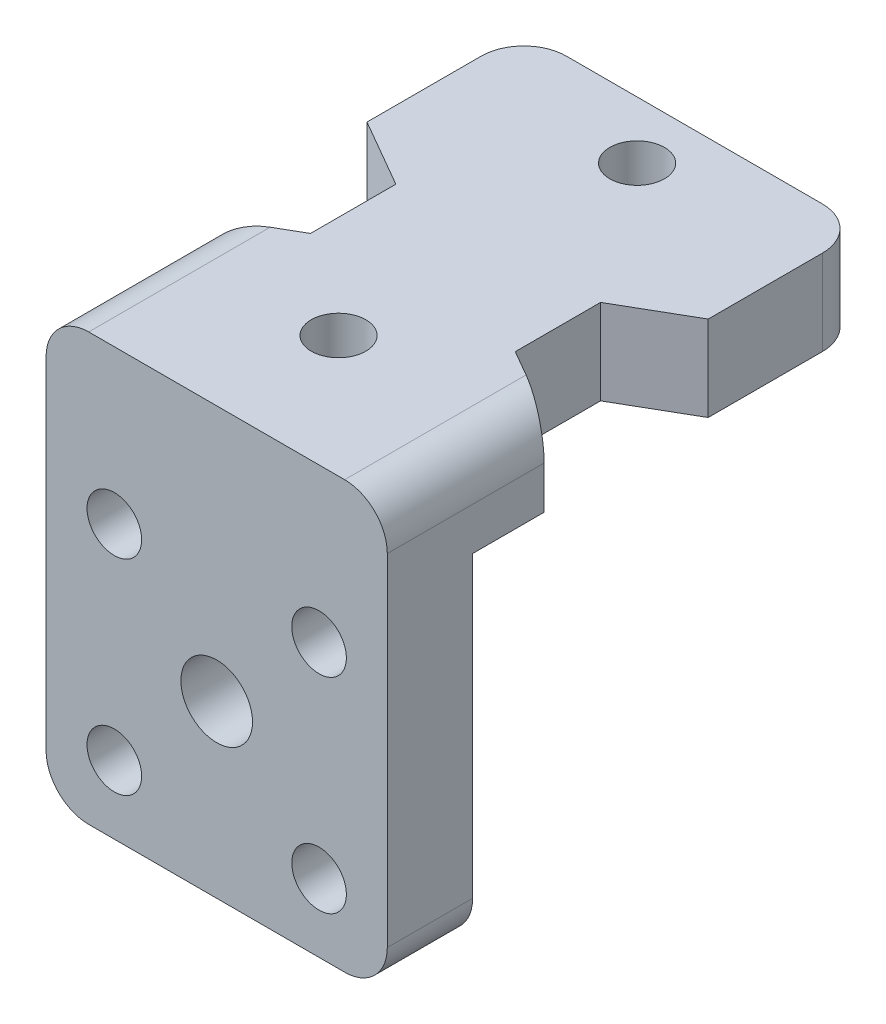
ISO-10303-21;
HEADER;
FILE_DESCRIPTION(('STEP AP214'),'2;1');
FILE_NAME('part.step','',(''),(''),'','','');
FILE_SCHEMA(('AUTOMOTIVE_DESIGN { 1 0 10303 214 1 1 1 1 }'));
ENDSEC;
DATA;
#1=APPLICATION_CONTEXT('core data for automotive mechanical design processes');
#2=APPLICATION_PROTOCOL_DEFINITION('international standard','automotive_design',2000,#1);
#3=PRODUCT_CONTEXT('',#1,'mechanical');
#4=PRODUCT('Part','Part','',(#3));
#5=PRODUCT_RELATED_PRODUCT_CATEGORY('part','',(#4));
#6=PRODUCT_DEFINITION_FORMATION('','',#4);
#7=PRODUCT_DEFINITION_CONTEXT('part definition',#1,'design');
#8=PRODUCT_DEFINITION('design','',#6,#7);
#9=PRODUCT_DEFINITION_SHAPE('','',#8);
#10=(LENGTH_UNIT() NAMED_UNIT(*) SI_UNIT(.MILLI.,.METRE.));
#11=(NAMED_UNIT(*) PLANE_ANGLE_UNIT() SI_UNIT($,.RADIAN.));
#12=(NAMED_UNIT(*) SI_UNIT($,.STERADIAN.) SOLID_ANGLE_UNIT());
#13=UNCERTAINTY_MEASURE_WITH_UNIT(LENGTH_MEASURE(1.E-05),#10,'distance_accuracy_value','');
#14=(GEOMETRIC_REPRESENTATION_CONTEXT(3) GLOBAL_UNCERTAINTY_ASSIGNED_CONTEXT((#13)) GLOBAL_UNIT_ASSIGNED_CONTEXT((#10,
#11,#12)) REPRESENTATION_CONTEXT('',''));
#15=CARTESIAN_POINT('',(0.,0.,0.));
#16=DIRECTION('',(0.,0.,1.));
#17=DIRECTION('',(1.,0.,0.));
#18=AXIS2_PLACEMENT_3D('',#15,#16,#17);
#19=CARTESIAN_POINT('',(10.,-10.,5.));
#20=DIRECTION('',(-1.,0.,0.));
#21=DIRECTION('',(0.,0.,1.));
#22=AXIS2_PLACEMENT_3D('',#19,#20,#21);
#23=PLANE('',#22);
#24=DIRECTION('',(0.,-1.,0.));
#25=VECTOR('',#24,1.);
#26=CARTESIAN_POINT('',(10.,15.,-4.19059892324151));
#27=LINE('',#26,#25);
#28=CARTESIAN_POINT('',(10.,12.5,-4.19059892324151));
#29=VERTEX_POINT('',#28);
#30=CARTESIAN_POINT('',(10.,10.,-4.19059892324151));
#31=VERTEX_POINT('',#30);
#32=EDGE_CURVE('E207',#29,#31,#27,.T.);
#33=ORIENTED_EDGE('',*,*,#32,.F.);
#34=DIRECTION('',(0.,0.,-1.));
#35=VECTOR('',#34,1.);
#36=CARTESIAN_POINT('',(10.,12.5,5.));
#37=LINE('',#36,#35);
#38=CARTESIAN_POINT('',(10.,12.5,5.));
#39=VERTEX_POINT('',#38);
#40=EDGE_CURVE('E388',#29,#39,#37,.F.);
#41=ORIENTED_EDGE('',*,*,#40,.T.);
#42=DIRECTION('',(0.,1.,0.));
#43=VECTOR('',#42,1.);
#44=CARTESIAN_POINT('',(10.,-10.,5.));
#45=LINE('',#44,#43);
#46=CARTESIAN_POINT('',(10.,-7.5,5.));
#47=VERTEX_POINT('',#46);
#48=EDGE_CURVE('E309',#47,#39,#45,.T.);
#49=ORIENTED_EDGE('',*,*,#48,.F.);
#50=DIRECTION('',(0.,0.,-1.));
#51=VECTOR('',#50,1.);
#52=CARTESIAN_POINT('',(10.,-7.5,5.));
#53=LINE('',#52,#51);
#54=CARTESIAN_POINT('',(10.,-7.5,0.));
#55=VERTEX_POINT('',#54);
#56=EDGE_CURVE('E321',#47,#55,#53,.T.);
#57=ORIENTED_EDGE('',*,*,#56,.T.);
#58=DIRECTION('',(0.,1.,0.));
#59=VECTOR('',#58,1.);
#60=CARTESIAN_POINT('',(10.,-10.,0.));
#61=LINE('',#60,#59);
#62=CARTESIAN_POINT('',(10.,10.,0.));
#63=VERTEX_POINT('',#62);
#64=EDGE_CURVE('E305',#55,#63,#61,.T.);
#65=ORIENTED_EDGE('',*,*,#64,.T.);
#66=DIRECTION('',(0.,0.,-1.));
#67=VECTOR('',#66,1.);
#68=CARTESIAN_POINT('',(10.,10.,5.));
#69=LINE('',#68,#67);
#70=EDGE_CURVE('E245',#63,#31,#69,.T.);
#71=ORIENTED_EDGE('',*,*,#70,.T.);
#72=EDGE_LOOP('',(#33,#41,#49,#57,#65,#71));
#73=FACE_BOUND('',#72,.T.);
#74=ADVANCED_FACE('F45',(#73),#23,.F.);
#75=CARTESIAN_POINT('',(-10.,-10.,5.));
#76=DIRECTION('',(1.,0.,0.));
#77=DIRECTION('',(0.,0.,-1.));
#78=AXIS2_PLACEMENT_3D('',#75,#76,#77);
#79=PLANE('',#78);
#80=DIRECTION('',(0.,-1.,0.));
#81=VECTOR('',#80,1.);
#82=CARTESIAN_POINT('',(-10.,-10.,5.));
#83=LINE('',#82,#81);
#84=CARTESIAN_POINT('',(-10.,12.5,5.));
#85=VERTEX_POINT('',#84);
#86=CARTESIAN_POINT('',(-10.,-7.5,5.));
#87=VERTEX_POINT('',#86);
#88=EDGE_CURVE('E313',#85,#87,#83,.T.);
#89=ORIENTED_EDGE('',*,*,#88,.F.);
#90=DIRECTION('',(0.,0.,1.));
#91=VECTOR('',#90,1.);
#92=CARTESIAN_POINT('',(-10.,12.5,5.));
#93=LINE('',#92,#91);
#94=CARTESIAN_POINT('',(-10.,12.5,-4.19059892324151));
#95=VERTEX_POINT('',#94);
#96=EDGE_CURVE('E379',#85,#95,#93,.F.);
#97=ORIENTED_EDGE('',*,*,#96,.T.);
#98=DIRECTION('',(0.,-1.,0.));
#99=VECTOR('',#98,1.);
#100=CARTESIAN_POINT('',(-10.,15.,-4.19059892324151));
#101=LINE('',#100,#99);
#102=CARTESIAN_POINT('',(-10.,10.,-4.19059892324151));
#103=VERTEX_POINT('',#102);
#104=EDGE_CURVE('E240',#95,#103,#101,.T.);
#105=ORIENTED_EDGE('',*,*,#104,.T.);
#106=DIRECTION('',(0.,0.,1.));
#107=VECTOR('',#106,1.);
#108=CARTESIAN_POINT('',(-10.,10.,5.));
#109=LINE('',#108,#107);
#110=CARTESIAN_POINT('',(-10.,10.,0.));
#111=VERTEX_POINT('',#110);
#112=EDGE_CURVE('E241',#103,#111,#109,.T.);
#113=ORIENTED_EDGE('',*,*,#112,.T.);
#114=DIRECTION('',(0.,-1.,0.));
#115=VECTOR('',#114,1.);
#116=CARTESIAN_POINT('',(-10.,-10.,0.));
#117=LINE('',#116,#115);
#118=CARTESIAN_POINT('',(-10.,-7.5,0.));
#119=VERTEX_POINT('',#118);
#120=EDGE_CURVE('E328',#111,#119,#117,.T.);
#121=ORIENTED_EDGE('',*,*,#120,.T.);
#122=DIRECTION('',(0.,0.,-1.));
#123=VECTOR('',#122,1.);
#124=CARTESIAN_POINT('',(-10.,-7.5,5.));
#125=LINE('',#124,#123);
#126=EDGE_CURVE('E357',#119,#87,#125,.F.);
#127=ORIENTED_EDGE('',*,*,#126,.T.);
#128=EDGE_LOOP('',(#89,#97,#105,#113,#121,#127));
#129=FACE_BOUND('',#128,.T.);
#130=ADVANCED_FACE('F442',(#129),#79,.F.);
#131=CARTESIAN_POINT('',(-10.,-10.,5.));
#132=DIRECTION('',(0.,1.,0.));
#133=DIRECTION('',(0.,0.,1.));
#134=AXIS2_PLACEMENT_3D('',#131,#132,#133);
#135=PLANE('',#134);
#136=DIRECTION('',(1.,0.,0.));
#137=VECTOR('',#136,1.);
#138=CARTESIAN_POINT('',(-10.,-10.,0.));
#139=LINE('',#138,#137);
#140=CARTESIAN_POINT('',(-7.5,-10.,0.));
#141=VERTEX_POINT('',#140);
#142=CARTESIAN_POINT('',(7.5,-10.,0.));
#143=VERTEX_POINT('',#142);
#144=EDGE_CURVE('E314',#141,#143,#139,.T.);
#145=ORIENTED_EDGE('',*,*,#144,.T.);
#146=DIRECTION('',(0.,0.,-1.));
#147=VECTOR('',#146,1.);
#148=CARTESIAN_POINT('',(7.5,-10.,5.));
#149=LINE('',#148,#147);
#150=CARTESIAN_POINT('',(7.5,-10.,5.));
#151=VERTEX_POINT('',#150);
#152=EDGE_CURVE('E348',#143,#151,#149,.F.);
#153=ORIENTED_EDGE('',*,*,#152,.T.);
#154=DIRECTION('',(1.,0.,0.));
#155=VECTOR('',#154,1.);
#156=CARTESIAN_POINT('',(-10.,-10.,5.));
#157=LINE('',#156,#155);
#158=CARTESIAN_POINT('',(-7.5,-10.,5.));
#159=VERTEX_POINT('',#158);
#160=EDGE_CURVE('E317',#159,#151,#157,.T.);
#161=ORIENTED_EDGE('',*,*,#160,.F.);
#162=DIRECTION('',(0.,0.,-1.));
#163=VECTOR('',#162,1.);
#164=CARTESIAN_POINT('',(-7.5,-10.,5.));
#165=LINE('',#164,#163);
#166=EDGE_CURVE('E344',#159,#141,#165,.T.);
#167=ORIENTED_EDGE('',*,*,#166,.T.);
#168=EDGE_LOOP('',(#145,#153,#161,#167));
#169=FACE_BOUND('',#168,.T.);
#170=ADVANCED_FACE('F449',(#169),#135,.F.);
#171=CARTESIAN_POINT('',(0.,0.,5.));
#172=DIRECTION('',(0.,0.,-1.));
#173=DIRECTION('',(-1.,0.,0.));
#174=AXIS2_PLACEMENT_3D('',#171,#172,#173);
#175=PLANE('',#174);
#176=CARTESIAN_POINT('',(6.,-6.,5.));
#177=DIRECTION('',(0.,0.,-1.));
#178=DIRECTION('',(-1.,0.,0.));
#179=AXIS2_PLACEMENT_3D('',#176,#177,#178);
#180=CIRCLE('',#179,1.6);
#181=CARTESIAN_POINT('',(4.4,-6.,5.));
#182=VERTEX_POINT('',#181);
#183=EDGE_CURVE('E494',#182,#182,#180,.T.);
#184=ORIENTED_EDGE('',*,*,#183,.T.);
#185=EDGE_LOOP('',(#184));
#186=FACE_BOUND('',#185,.T.);
#187=CARTESIAN_POINT('',(-6.,-6.,5.));
#188=DIRECTION('',(0.,0.,-1.));
#189=DIRECTION('',(-1.,0.,0.));
#190=AXIS2_PLACEMENT_3D('',#187,#188,#189);
#191=CIRCLE('',#190,1.6);
#192=CARTESIAN_POINT('',(-7.6,-6.,5.));
#193=VERTEX_POINT('',#192);
#194=EDGE_CURVE('E501',#193,#193,#191,.T.);
#195=ORIENTED_EDGE('',*,*,#194,.T.);
#196=EDGE_LOOP('',(#195));
#197=FACE_BOUND('',#196,.T.);
#198=CARTESIAN_POINT('',(-6.,6.,5.));
#199=DIRECTION('',(0.,0.,-1.));
#200=DIRECTION('',(-1.,0.,0.));
#201=AXIS2_PLACEMENT_3D('',#198,#199,#200);
#202=CIRCLE('',#201,1.6);
#203=CARTESIAN_POINT('',(-7.6,6.,5.));
#204=VERTEX_POINT('',#203);
#205=EDGE_CURVE('E505',#204,#204,#202,.T.);
#206=ORIENTED_EDGE('',*,*,#205,.T.);
#207=EDGE_LOOP('',(#206));
#208=FACE_BOUND('',#207,.T.);
#209=CARTESIAN_POINT('',(6.,6.,5.));
#210=DIRECTION('',(0.,0.,-1.));
#211=DIRECTION('',(-1.,0.,0.));
#212=AXIS2_PLACEMENT_3D('',#209,#210,#211);
#213=CIRCLE('',#212,1.6);
#214=CARTESIAN_POINT('',(4.4,6.,5.));
#215=VERTEX_POINT('',#214);
#216=EDGE_CURVE('E509',#215,#215,#213,.T.);
#217=ORIENTED_EDGE('',*,*,#216,.T.);
#218=EDGE_LOOP('',(#217));
#219=FACE_BOUND('',#218,.T.);
#220=CARTESIAN_POINT('',(0.,0.,5.));
#221=DIRECTION('',(0.,0.,1.));
#222=DIRECTION('',(1.,0.,0.));
#223=AXIS2_PLACEMENT_3D('',#220,#221,#222);
#224=CIRCLE('',#223,2.1);
#225=CARTESIAN_POINT('',(2.1,0.,5.));
#226=VERTEX_POINT('',#225);
#227=EDGE_CURVE('E300',#226,#226,#224,.T.);
#228=ORIENTED_EDGE('',*,*,#227,.F.);
#229=EDGE_LOOP('',(#228));
#230=FACE_BOUND('',#229,.T.);
#231=DIRECTION('',(1.,0.,0.));
#232=VECTOR('',#231,1.);
#233=CARTESIAN_POINT('',(-10.,15.,5.));
#234=LINE('',#233,#232);
#235=CARTESIAN_POINT('',(-7.5,15.,5.));
#236=VERTEX_POINT('',#235);
#237=CARTESIAN_POINT('',(7.5,15.,5.));
#238=VERTEX_POINT('',#237);
#239=EDGE_CURVE('E197',#236,#238,#234,.T.);
#240=ORIENTED_EDGE('',*,*,#239,.F.);
#241=CARTESIAN_POINT('',(-7.5,12.5,5.));
#242=DIRECTION('',(0.,0.,-1.));
#243=DIRECTION('',(-1.,0.,0.));
#244=AXIS2_PLACEMENT_3D('',#241,#242,#243);
#245=CIRCLE('',#244,2.5);
#246=EDGE_CURVE('E376',#236,#85,#245,.F.);
#247=ORIENTED_EDGE('',*,*,#246,.T.);
#248=ORIENTED_EDGE('',*,*,#88,.T.);
#249=CARTESIAN_POINT('',(-7.5,-7.5,5.));
#250=DIRECTION('',(0.,0.,-1.));
#251=DIRECTION('',(-1.,0.,0.));
#252=AXIS2_PLACEMENT_3D('',#249,#250,#251);
#253=CIRCLE('',#252,2.5);
#254=EDGE_CURVE('E351',#87,#159,#253,.F.);
#255=ORIENTED_EDGE('',*,*,#254,.T.);
#256=ORIENTED_EDGE('',*,*,#160,.T.);
#257=CARTESIAN_POINT('',(7.5,-7.5,5.));
#258=DIRECTION('',(0.,0.,-1.));
#259=DIRECTION('',(-1.,0.,0.));
#260=AXIS2_PLACEMENT_3D('',#257,#258,#259);
#261=CIRCLE('',#260,2.5);
#262=EDGE_CURVE('E354',#151,#47,#261,.F.);
#263=ORIENTED_EDGE('',*,*,#262,.T.);
#264=ORIENTED_EDGE('',*,*,#48,.T.);
#265=CARTESIAN_POINT('',(7.5,12.5,5.));
#266=DIRECTION('',(0.,0.,-1.));
#267=DIRECTION('',(-1.,0.,0.));
#268=AXIS2_PLACEMENT_3D('',#265,#266,#267);
#269=CIRCLE('',#268,2.5);
#270=EDGE_CURVE('E373',#39,#238,#269,.F.);
#271=ORIENTED_EDGE('',*,*,#270,.T.);
#272=EDGE_LOOP('',(#240,#247,#248,#255,#256,#263,#264,#271));
#273=FACE_BOUND('',#272,.T.);
#274=ADVANCED_FACE('F477',(#186,#197,#208,#219,#230,#273),#175,.F.);
#275=CARTESIAN_POINT('',(0.,0.,0.));
#276=DIRECTION('',(0.,0.,-1.));
#277=DIRECTION('',(-1.,0.,0.));
#278=AXIS2_PLACEMENT_3D('',#275,#276,#277);
#279=PLANE('',#278);
#280=CARTESIAN_POINT('',(6.,-6.,0.));
#281=DIRECTION('',(0.,0.,-1.));
#282=DIRECTION('',(-1.,0.,0.));
#283=AXIS2_PLACEMENT_3D('',#280,#281,#282);
#284=CIRCLE('',#283,1.6);
#285=CARTESIAN_POINT('',(4.4,-6.,0.));
#286=VERTEX_POINT('',#285);
#287=EDGE_CURVE('E518',#286,#286,#284,.T.);
#288=ORIENTED_EDGE('',*,*,#287,.F.);
#289=EDGE_LOOP('',(#288));
#290=FACE_BOUND('',#289,.T.);
#291=CARTESIAN_POINT('',(-6.,-6.,0.));
#292=DIRECTION('',(0.,0.,-1.));
#293=DIRECTION('',(-1.,0.,0.));
#294=AXIS2_PLACEMENT_3D('',#291,#292,#293);
#295=CIRCLE('',#294,1.6);
#296=CARTESIAN_POINT('',(-7.6,-6.,0.));
#297=VERTEX_POINT('',#296);
#298=EDGE_CURVE('E522',#297,#297,#295,.T.);
#299=ORIENTED_EDGE('',*,*,#298,.F.);
#300=EDGE_LOOP('',(#299));
#301=FACE_BOUND('',#300,.T.);
#302=CARTESIAN_POINT('',(-6.,6.,0.));
#303=DIRECTION('',(0.,0.,-1.));
#304=DIRECTION('',(-1.,0.,0.));
#305=AXIS2_PLACEMENT_3D('',#302,#303,#304);
#306=CIRCLE('',#305,1.6);
#307=CARTESIAN_POINT('',(-7.6,6.,0.));
#308=VERTEX_POINT('',#307);
#309=EDGE_CURVE('E517',#308,#308,#306,.T.);
#310=ORIENTED_EDGE('',*,*,#309,.F.);
#311=EDGE_LOOP('',(#310));
#312=FACE_BOUND('',#311,.T.);
#313=CARTESIAN_POINT('',(6.,6.,0.));
#314=DIRECTION('',(0.,0.,-1.));
#315=DIRECTION('',(-1.,0.,0.));
#316=AXIS2_PLACEMENT_3D('',#313,#314,#315);
#317=CIRCLE('',#316,1.6);
#318=CARTESIAN_POINT('',(4.4,6.,0.));
#319=VERTEX_POINT('',#318);
#320=EDGE_CURVE('E513',#319,#319,#317,.T.);
#321=ORIENTED_EDGE('',*,*,#320,.F.);
#322=EDGE_LOOP('',(#321));
#323=FACE_BOUND('',#322,.T.);
#324=CARTESIAN_POINT('',(0.,0.,0.));
#325=DIRECTION('',(0.,0.,1.));
#326=DIRECTION('',(1.,0.,0.));
#327=AXIS2_PLACEMENT_3D('',#324,#325,#326);
#328=CIRCLE('',#327,2.1);
#329=CARTESIAN_POINT('',(2.1,0.,0.));
#330=VERTEX_POINT('',#329);
#331=EDGE_CURVE('E301',#330,#330,#328,.T.);
#332=ORIENTED_EDGE('',*,*,#331,.T.);
#333=EDGE_LOOP('',(#332));
#334=FACE_BOUND('',#333,.T.);
#335=ORIENTED_EDGE('',*,*,#64,.F.);
#336=CARTESIAN_POINT('',(7.5,-7.5,0.));
#337=DIRECTION('',(0.,0.,-1.));
#338=DIRECTION('',(-1.,0.,0.));
#339=AXIS2_PLACEMENT_3D('',#336,#337,#338);
#340=CIRCLE('',#339,2.5);
#341=EDGE_CURVE('E341',#55,#143,#340,.T.);
#342=ORIENTED_EDGE('',*,*,#341,.T.);
#343=ORIENTED_EDGE('',*,*,#144,.F.);
#344=CARTESIAN_POINT('',(-7.5,-7.5,0.));
#345=DIRECTION('',(0.,0.,-1.));
#346=DIRECTION('',(-1.,0.,0.));
#347=AXIS2_PLACEMENT_3D('',#344,#345,#346);
#348=CIRCLE('',#347,2.5);
#349=EDGE_CURVE('E338',#141,#119,#348,.T.);
#350=ORIENTED_EDGE('',*,*,#349,.T.);
#351=ORIENTED_EDGE('',*,*,#120,.F.);
#352=DIRECTION('',(-1.,0.,0.));
#353=VECTOR('',#352,1.);
#354=CARTESIAN_POINT('',(-10.,10.,0.));
#355=LINE('',#354,#353);
#356=EDGE_CURVE('E324',#63,#111,#355,.T.);
#357=ORIENTED_EDGE('',*,*,#356,.F.);
#358=EDGE_LOOP('',(#335,#342,#343,#350,#351,#357));
#359=FACE_BOUND('',#358,.T.);
#360=ADVANCED_FACE('F532',(#290,#301,#312,#323,#334,#359),#279,.T.);
#361=CARTESIAN_POINT('',(0.,0.,0.));
#362=DIRECTION('',(0.,0.,1.));
#363=DIRECTION('',(1.,0.,0.));
#364=AXIS2_PLACEMENT_3D('',#361,#362,#363);
#365=CYLINDRICAL_SURFACE('',#364,2.1);
#366=ORIENTED_EDGE('',*,*,#331,.F.);
#367=EDGE_LOOP('',(#366));
#368=FACE_BOUND('',#367,.T.);
#369=ORIENTED_EDGE('',*,*,#227,.T.);
#370=EDGE_LOOP('',(#369));
#371=FACE_BOUND('',#370,.T.);
#372=ADVANCED_FACE('F459',(#368,#371),#365,.F.);
#373=CARTESIAN_POINT('',(7.5,-7.5,5.));
#374=DIRECTION('',(0.,0.,-1.));
#375=DIRECTION('',(-1.,0.,0.));
#376=AXIS2_PLACEMENT_3D('',#373,#374,#375);
#377=CYLINDRICAL_SURFACE('',#376,2.5);
#378=ORIENTED_EDGE('',*,*,#262,.F.);
#379=ORIENTED_EDGE('',*,*,#152,.F.);
#380=ORIENTED_EDGE('',*,*,#341,.F.);
#381=ORIENTED_EDGE('',*,*,#56,.F.);
#382=EDGE_LOOP('',(#378,#379,#380,#381));
#383=FACE_BOUND('',#382,.T.);
#384=ADVANCED_FACE('F455',(#383),#377,.T.);
#385=CARTESIAN_POINT('',(-7.5,-7.5,5.));
#386=DIRECTION('',(0.,0.,-1.));
#387=DIRECTION('',(-1.,0.,0.));
#388=AXIS2_PLACEMENT_3D('',#385,#386,#387);
#389=CYLINDRICAL_SURFACE('',#388,2.5);
#390=ORIENTED_EDGE('',*,*,#254,.F.);
#391=ORIENTED_EDGE('',*,*,#126,.F.);
#392=ORIENTED_EDGE('',*,*,#349,.F.);
#393=ORIENTED_EDGE('',*,*,#166,.F.);
#394=EDGE_LOOP('',(#390,#391,#392,#393));
#395=FACE_BOUND('',#394,.T.);
#396=ADVANCED_FACE('F458',(#395),#389,.T.);
#397=CARTESIAN_POINT('',(0.,15.,0.));
#398=DIRECTION('',(0.,-1.,0.));
#399=DIRECTION('',(0.,0.,-1.));
#400=AXIS2_PLACEMENT_3D('',#397,#398,#399);
#401=PLANE('',#400);
#402=DIRECTION('',(-0.86602540378444,0.,0.499999999999998));
#403=VECTOR('',#402,1.);
#404=CARTESIAN_POINT('',(-6.,15.,-6.5));
#405=LINE('',#404,#403);
#406=CARTESIAN_POINT('',(-6.,15.,-6.5));
#407=VERTEX_POINT('',#406);
#408=CARTESIAN_POINT('',(-7.5,15.,-5.63397459621556));
#409=VERTEX_POINT('',#408);
#410=EDGE_CURVE('E237',#407,#409,#405,.T.);
#411=ORIENTED_EDGE('',*,*,#410,.T.);
#412=DIRECTION('',(0.,0.,1.));
#413=VECTOR('',#412,1.);
#414=CARTESIAN_POINT('',(-7.5,15.,0.));
#415=LINE('',#414,#413);
#416=EDGE_CURVE('E369',#409,#236,#415,.T.);
#417=ORIENTED_EDGE('',*,*,#416,.T.);
#418=ORIENTED_EDGE('',*,*,#239,.T.);
#419=DIRECTION('',(0.,0.,-1.));
#420=VECTOR('',#419,1.);
#421=CARTESIAN_POINT('',(7.5,15.,0.));
#422=LINE('',#421,#420);
#423=CARTESIAN_POINT('',(7.5,15.,-5.63397459621556));
#424=VERTEX_POINT('',#423);
#425=EDGE_CURVE('E194',#238,#424,#422,.T.);
#426=ORIENTED_EDGE('',*,*,#425,.T.);
#427=DIRECTION('',(-0.86602540378444,0.,-0.499999999999998));
#428=VECTOR('',#427,1.);
#429=CARTESIAN_POINT('',(6.,15.,-6.5));
#430=LINE('',#429,#428);
#431=CARTESIAN_POINT('',(6.,15.,-6.5));
#432=VERTEX_POINT('',#431);
#433=EDGE_CURVE('E184',#424,#432,#430,.T.);
#434=ORIENTED_EDGE('',*,*,#433,.T.);
#435=DIRECTION('',(0.,0.,-1.));
#436=VECTOR('',#435,1.);
#437=CARTESIAN_POINT('',(6.,15.,-11.5));
#438=LINE('',#437,#436);
#439=CARTESIAN_POINT('',(6.,15.,-11.5));
#440=VERTEX_POINT('',#439);
#441=EDGE_CURVE('E190',#432,#440,#438,.T.);
#442=ORIENTED_EDGE('',*,*,#441,.T.);
#443=DIRECTION('',(0.86602540378444,0.,-0.499999999999998));
#444=VECTOR('',#443,1.);
#445=CARTESIAN_POINT('',(10.,15.,-13.8094010767585));
#446=LINE('',#445,#444);
#447=CARTESIAN_POINT('',(10.,15.,-13.8094010767585));
#448=VERTEX_POINT('',#447);
#449=EDGE_CURVE('E214',#440,#448,#446,.T.);
#450=ORIENTED_EDGE('',*,*,#449,.T.);
#451=DIRECTION('',(0.,0.,-1.));
#452=VECTOR('',#451,1.);
#453=CARTESIAN_POINT('',(10.,15.,-13.8094010767585));
#454=LINE('',#453,#452);
#455=CARTESIAN_POINT('',(10.,15.,-20.5));
#456=VERTEX_POINT('',#455);
#457=EDGE_CURVE('E217',#448,#456,#454,.T.);
#458=ORIENTED_EDGE('',*,*,#457,.T.);
#459=CARTESIAN_POINT('',(7.5,15.,-20.5));
#460=DIRECTION('',(0.,-1.,0.));
#461=DIRECTION('',(0.,0.,-1.));
#462=AXIS2_PLACEMENT_3D('',#459,#460,#461);
#463=CIRCLE('',#462,2.5);
#464=CARTESIAN_POINT('',(7.5,15.,-23.));
#465=VERTEX_POINT('',#464);
#466=EDGE_CURVE('E364',#456,#465,#463,.F.);
#467=ORIENTED_EDGE('',*,*,#466,.T.);
#468=DIRECTION('',(-1.,0.,0.));
#469=VECTOR('',#468,1.);
#470=CARTESIAN_POINT('',(-10.,15.,-23.));
#471=LINE('',#470,#469);
#472=CARTESIAN_POINT('',(-7.5,15.,-23.));
#473=VERTEX_POINT('',#472);
#474=EDGE_CURVE('E224',#465,#473,#471,.T.);
#475=ORIENTED_EDGE('',*,*,#474,.T.);
#476=CARTESIAN_POINT('',(-7.5,15.,-20.5));
#477=DIRECTION('',(0.,-1.,0.));
#478=DIRECTION('',(0.,0.,-1.));
#479=AXIS2_PLACEMENT_3D('',#476,#477,#478);
#480=CIRCLE('',#479,2.5);
#481=CARTESIAN_POINT('',(-10.,15.,-20.5));
#482=VERTEX_POINT('',#481);
#483=EDGE_CURVE('E361',#473,#482,#480,.F.);
#484=ORIENTED_EDGE('',*,*,#483,.T.);
#485=DIRECTION('',(0.,0.,1.));
#486=VECTOR('',#485,1.);
#487=CARTESIAN_POINT('',(-10.,15.,-13.8094010767585));
#488=LINE('',#487,#486);
#489=CARTESIAN_POINT('',(-10.,15.,-13.8094010767585));
#490=VERTEX_POINT('',#489);
#491=EDGE_CURVE('E228',#482,#490,#488,.T.);
#492=ORIENTED_EDGE('',*,*,#491,.T.);
#493=DIRECTION('',(0.86602540378444,0.,0.499999999999998));
#494=VECTOR('',#493,1.);
#495=CARTESIAN_POINT('',(-10.,15.,-13.8094010767585));
#496=LINE('',#495,#494);
#497=CARTESIAN_POINT('',(-6.,15.,-11.5));
#498=VERTEX_POINT('',#497);
#499=EDGE_CURVE('E231',#490,#498,#496,.T.);
#500=ORIENTED_EDGE('',*,*,#499,.T.);
#501=DIRECTION('',(0.,0.,1.));
#502=VECTOR('',#501,1.);
#503=CARTESIAN_POINT('',(-6.,15.,-11.5));
#504=LINE('',#503,#502);
#505=EDGE_CURVE('E234',#498,#407,#504,.T.);
#506=ORIENTED_EDGE('',*,*,#505,.T.);
#507=EDGE_LOOP('',(#411,#417,#418,#426,#434,#442,#450,#458,#467,#475,#484,#492,#500,#506));
#508=FACE_BOUND('',#507,.T.);
#509=CARTESIAN_POINT('',(0.,15.,-2.14148350265543));
#510=DIRECTION('',(0.,1.,0.));
#511=DIRECTION('',(0.,0.,1.));
#512=AXIS2_PLACEMENT_3D('',#509,#510,#511);
#513=CIRCLE('',#512,1.6);
#514=CARTESIAN_POINT('',(0.,15.,-0.541483502655434));
#515=VERTEX_POINT('',#514);
#516=EDGE_CURVE('E246',#515,#515,#513,.T.);
#517=ORIENTED_EDGE('',*,*,#516,.F.);
#518=EDGE_LOOP('',(#517));
#519=FACE_BOUND('',#518,.T.);
#520=CARTESIAN_POINT('',(0.,15.,-19.6414835026554));
#521=DIRECTION('',(0.,1.,0.));
#522=DIRECTION('',(0.,0.,1.));
#523=AXIS2_PLACEMENT_3D('',#520,#521,#522);
#524=CIRCLE('',#523,1.6);
#525=CARTESIAN_POINT('',(0.,15.,-18.0414835026554));
#526=VERTEX_POINT('',#525);
#527=EDGE_CURVE('E486',#526,#526,#524,.T.);
#528=ORIENTED_EDGE('',*,*,#527,.F.);
#529=EDGE_LOOP('',(#528));
#530=FACE_BOUND('',#529,.T.);
#531=ADVANCED_FACE('F187',(#508,#519,#530),#401,.F.);
#532=CARTESIAN_POINT('',(0.,10.,0.));
#533=DIRECTION('',(0.,-1.,0.));
#534=DIRECTION('',(0.,0.,-1.));
#535=AXIS2_PLACEMENT_3D('',#532,#533,#534);
#536=PLANE('',#535);
#537=CARTESIAN_POINT('',(0.,10.,-2.14148350265543));
#538=DIRECTION('',(0.,1.,0.));
#539=DIRECTION('',(0.,0.,1.));
#540=AXIS2_PLACEMENT_3D('',#537,#538,#539);
#541=CIRCLE('',#540,1.6);
#542=CARTESIAN_POINT('',(0.,10.,-0.541483502655434));
#543=VERTEX_POINT('',#542);
#544=EDGE_CURVE('E482',#543,#543,#541,.T.);
#545=ORIENTED_EDGE('',*,*,#544,.T.);
#546=EDGE_LOOP('',(#545));
#547=FACE_BOUND('',#546,.T.);
#548=DIRECTION('',(-1.,0.,0.));
#549=VECTOR('',#548,1.);
#550=CARTESIAN_POINT('',(-10.,10.,-23.));
#551=LINE('',#550,#549);
#552=CARTESIAN_POINT('',(7.5,10.,-23.));
#553=VERTEX_POINT('',#552);
#554=CARTESIAN_POINT('',(-7.5,10.,-23.));
#555=VERTEX_POINT('',#554);
#556=EDGE_CURVE('E261',#553,#555,#551,.T.);
#557=ORIENTED_EDGE('',*,*,#556,.F.);
#558=CARTESIAN_POINT('',(7.5,10.,-20.5));
#559=DIRECTION('',(0.,-1.,0.));
#560=DIRECTION('',(0.,0.,-1.));
#561=AXIS2_PLACEMENT_3D('',#558,#559,#560);
#562=CIRCLE('',#561,2.5);
#563=CARTESIAN_POINT('',(10.,10.,-20.5));
#564=VERTEX_POINT('',#563);
#565=EDGE_CURVE('E61',#553,#564,#562,.T.);
#566=ORIENTED_EDGE('',*,*,#565,.T.);
#567=DIRECTION('',(0.,0.,-1.));
#568=VECTOR('',#567,1.);
#569=CARTESIAN_POINT('',(10.,10.,-13.8094010767585));
#570=LINE('',#569,#568);
#571=CARTESIAN_POINT('',(10.,10.,-13.8094010767585));
#572=VERTEX_POINT('',#571);
#573=EDGE_CURVE('E258',#572,#564,#570,.T.);
#574=ORIENTED_EDGE('',*,*,#573,.F.);
#575=DIRECTION('',(0.86602540378444,0.,-0.499999999999998));
#576=VECTOR('',#575,1.);
#577=CARTESIAN_POINT('',(10.,10.,-13.8094010767585));
#578=LINE('',#577,#576);
#579=CARTESIAN_POINT('',(6.,10.,-11.5));
#580=VERTEX_POINT('',#579);
#581=EDGE_CURVE('E255',#580,#572,#578,.T.);
#582=ORIENTED_EDGE('',*,*,#581,.F.);
#583=DIRECTION('',(0.,0.,-1.));
#584=VECTOR('',#583,1.);
#585=CARTESIAN_POINT('',(6.,10.,-11.5));
#586=LINE('',#585,#584);
#587=CARTESIAN_POINT('',(6.,10.,-6.5));
#588=VERTEX_POINT('',#587);
#589=EDGE_CURVE('E252',#588,#580,#586,.T.);
#590=ORIENTED_EDGE('',*,*,#589,.F.);
#591=DIRECTION('',(-0.86602540378444,0.,-0.499999999999998));
#592=VECTOR('',#591,1.);
#593=CARTESIAN_POINT('',(6.,10.,-6.5));
#594=LINE('',#593,#592);
#595=EDGE_CURVE('E203',#31,#588,#594,.T.);
#596=ORIENTED_EDGE('',*,*,#595,.F.);
#597=ORIENTED_EDGE('',*,*,#70,.F.);
#598=ORIENTED_EDGE('',*,*,#356,.T.);
#599=ORIENTED_EDGE('',*,*,#112,.F.);
#600=DIRECTION('',(-0.86602540378444,0.,0.499999999999998));
#601=VECTOR('',#600,1.);
#602=CARTESIAN_POINT('',(-6.,10.,-6.5));
#603=LINE('',#602,#601);
#604=CARTESIAN_POINT('',(-6.,10.,-6.5));
#605=VERTEX_POINT('',#604);
#606=EDGE_CURVE('E274',#605,#103,#603,.T.);
#607=ORIENTED_EDGE('',*,*,#606,.F.);
#608=DIRECTION('',(0.,0.,1.));
#609=VECTOR('',#608,1.);
#610=CARTESIAN_POINT('',(-6.,10.,-11.5));
#611=LINE('',#610,#609);
#612=CARTESIAN_POINT('',(-6.,10.,-11.5));
#613=VERTEX_POINT('',#612);
#614=EDGE_CURVE('E271',#613,#605,#611,.T.);
#615=ORIENTED_EDGE('',*,*,#614,.F.);
#616=DIRECTION('',(0.86602540378444,0.,0.499999999999998));
#617=VECTOR('',#616,1.);
#618=CARTESIAN_POINT('',(-10.,10.,-13.8094010767585));
#619=LINE('',#618,#617);
#620=CARTESIAN_POINT('',(-10.,10.,-13.8094010767585));
#621=VERTEX_POINT('',#620);
#622=EDGE_CURVE('E268',#621,#613,#619,.T.);
#623=ORIENTED_EDGE('',*,*,#622,.F.);
#624=DIRECTION('',(0.,0.,1.));
#625=VECTOR('',#624,1.);
#626=CARTESIAN_POINT('',(-10.,10.,-13.8094010767585));
#627=LINE('',#626,#625);
#628=CARTESIAN_POINT('',(-10.,10.,-20.5));
#629=VERTEX_POINT('',#628);
#630=EDGE_CURVE('E265',#629,#621,#627,.T.);
#631=ORIENTED_EDGE('',*,*,#630,.F.);
#632=CARTESIAN_POINT('',(-7.5,10.,-20.5));
#633=DIRECTION('',(0.,-1.,0.));
#634=DIRECTION('',(0.,0.,-1.));
#635=AXIS2_PLACEMENT_3D('',#632,#633,#634);
#636=CIRCLE('',#635,2.5);
#637=EDGE_CURVE('E69',#629,#555,#636,.T.);
#638=ORIENTED_EDGE('',*,*,#637,.T.);
#639=EDGE_LOOP('',(#557,#566,#574,#582,#590,#596,#597,#598,#599,#607,#615,#623,#631,#638));
#640=FACE_BOUND('',#639,.T.);
#641=CARTESIAN_POINT('',(0.,10.,-19.6414835026554));
#642=DIRECTION('',(0.,1.,0.));
#643=DIRECTION('',(0.,0.,1.));
#644=AXIS2_PLACEMENT_3D('',#641,#642,#643);
#645=CIRCLE('',#644,1.6);
#646=CARTESIAN_POINT('',(0.,10.,-18.0414835026554));
#647=VERTEX_POINT('',#646);
#648=EDGE_CURVE('E490',#647,#647,#645,.T.);
#649=ORIENTED_EDGE('',*,*,#648,.T.);
#650=EDGE_LOOP('',(#649));
#651=FACE_BOUND('',#650,.T.);
#652=ADVANCED_FACE('F414',(#547,#640,#651),#536,.T.);
#653=CARTESIAN_POINT('',(6.,15.,-6.5));
#654=DIRECTION('',(-0.499999999999998,0.,0.86602540378444));
#655=DIRECTION('',(0.86602540378444,0.,0.499999999999998));
#656=AXIS2_PLACEMENT_3D('',#653,#654,#655);
#657=PLANE('',#656);
#658=ORIENTED_EDGE('',*,*,#433,.F.);
#659=CARTESIAN_POINT('',(7.5,12.5,-5.63397459621556));
#660=DIRECTION('',(-0.499999999999998,0.,0.86602540378444));
#661=DIRECTION('',(-0.86602540378444,0.,-0.499999999999998));
#662=AXIS2_PLACEMENT_3D('',#659,#660,#661);
#663=ELLIPSE('',#662,2.88675134594813,2.5);
#664=EDGE_CURVE('E385',#424,#29,#663,.F.);
#665=ORIENTED_EDGE('',*,*,#664,.T.);
#666=ORIENTED_EDGE('',*,*,#32,.T.);
#667=ORIENTED_EDGE('',*,*,#595,.T.);
#668=DIRECTION('',(0.,-1.,0.));
#669=VECTOR('',#668,1.);
#670=CARTESIAN_POINT('',(6.,15.,-6.5));
#671=LINE('',#670,#669);
#672=EDGE_CURVE('E200',#432,#588,#671,.T.);
#673=ORIENTED_EDGE('',*,*,#672,.F.);
#674=EDGE_LOOP('',(#658,#665,#666,#667,#673));
#675=FACE_BOUND('',#674,.T.);
#676=ADVANCED_FACE('F201',(#675),#657,.F.);
#677=CARTESIAN_POINT('',(6.,15.,-11.5));
#678=DIRECTION('',(-1.,0.,0.));
#679=DIRECTION('',(0.,0.,1.));
#680=AXIS2_PLACEMENT_3D('',#677,#678,#679);
#681=PLANE('',#680);
#682=ORIENTED_EDGE('',*,*,#589,.T.);
#683=DIRECTION('',(0.,-1.,0.));
#684=VECTOR('',#683,1.);
#685=CARTESIAN_POINT('',(6.,15.,-11.5));
#686=LINE('',#685,#684);
#687=EDGE_CURVE('E208',#440,#580,#686,.T.);
#688=ORIENTED_EDGE('',*,*,#687,.F.);
#689=ORIENTED_EDGE('',*,*,#441,.F.);
#690=ORIENTED_EDGE('',*,*,#672,.T.);
#691=EDGE_LOOP('',(#682,#688,#689,#690));
#692=FACE_BOUND('',#691,.T.);
#693=ADVANCED_FACE('F210',(#692),#681,.F.);
#694=CARTESIAN_POINT('',(10.,15.,-13.8094010767585));
#695=DIRECTION('',(-0.499999999999998,0.,-0.86602540378444));
#696=DIRECTION('',(-0.86602540378444,0.,0.499999999999998));
#697=AXIS2_PLACEMENT_3D('',#694,#695,#696);
#698=PLANE('',#697);
#699=ORIENTED_EDGE('',*,*,#581,.T.);
#700=DIRECTION('',(0.,-1.,0.));
#701=VECTOR('',#700,1.);
#702=CARTESIAN_POINT('',(10.,15.,-13.8094010767585));
#703=LINE('',#702,#701);
#704=EDGE_CURVE('E292',#448,#572,#703,.T.);
#705=ORIENTED_EDGE('',*,*,#704,.F.);
#706=ORIENTED_EDGE('',*,*,#449,.F.);
#707=ORIENTED_EDGE('',*,*,#687,.T.);
#708=EDGE_LOOP('',(#699,#705,#706,#707));
#709=FACE_BOUND('',#708,.T.);
#710=ADVANCED_FACE('F559',(#709),#698,.F.);
#711=CARTESIAN_POINT('',(10.,15.,-13.8094010767585));
#712=DIRECTION('',(-1.,0.,0.));
#713=DIRECTION('',(0.,0.,1.));
#714=AXIS2_PLACEMENT_3D('',#711,#712,#713);
#715=PLANE('',#714);
#716=ORIENTED_EDGE('',*,*,#573,.T.);
#717=DIRECTION('',(0.,-1.,0.));
#718=VECTOR('',#717,1.);
#719=CARTESIAN_POINT('',(10.,15.,-20.5));
#720=LINE('',#719,#718);
#721=EDGE_CURVE('E54',#564,#456,#720,.F.);
#722=ORIENTED_EDGE('',*,*,#721,.T.);
#723=ORIENTED_EDGE('',*,*,#457,.F.);
#724=ORIENTED_EDGE('',*,*,#704,.T.);
#725=EDGE_LOOP('',(#716,#722,#723,#724));
#726=FACE_BOUND('',#725,.T.);
#727=ADVANCED_FACE('F405',(#726),#715,.F.);
#728=CARTESIAN_POINT('',(-10.,15.,-23.));
#729=DIRECTION('',(0.,0.,1.));
#730=DIRECTION('',(1.,0.,0.));
#731=AXIS2_PLACEMENT_3D('',#728,#729,#730);
#732=PLANE('',#731);
#733=ORIENTED_EDGE('',*,*,#474,.F.);
#734=DIRECTION('',(0.,-1.,0.));
#735=VECTOR('',#734,1.);
#736=CARTESIAN_POINT('',(7.5,15.,-23.));
#737=LINE('',#736,#735);
#738=EDGE_CURVE('E394',#465,#553,#737,.T.);
#739=ORIENTED_EDGE('',*,*,#738,.T.);
#740=ORIENTED_EDGE('',*,*,#556,.T.);
#741=DIRECTION('',(0.,-1.,0.));
#742=VECTOR('',#741,1.);
#743=CARTESIAN_POINT('',(-7.5,15.,-23.));
#744=LINE('',#743,#742);
#745=EDGE_CURVE('E391',#555,#473,#744,.F.);
#746=ORIENTED_EDGE('',*,*,#745,.T.);
#747=EDGE_LOOP('',(#733,#739,#740,#746));
#748=FACE_BOUND('',#747,.T.);
#749=ADVANCED_FACE('F413',(#748),#732,.F.);
#750=CARTESIAN_POINT('',(-10.,15.,-13.8094010767585));
#751=DIRECTION('',(1.,0.,0.));
#752=DIRECTION('',(0.,0.,-1.));
#753=AXIS2_PLACEMENT_3D('',#750,#751,#752);
#754=PLANE('',#753);
#755=ORIENTED_EDGE('',*,*,#491,.F.);
#756=DIRECTION('',(0.,-1.,0.));
#757=VECTOR('',#756,1.);
#758=CARTESIAN_POINT('',(-10.,15.,-20.5));
#759=LINE('',#758,#757);
#760=EDGE_CURVE('E11',#482,#629,#759,.T.);
#761=ORIENTED_EDGE('',*,*,#760,.T.);
#762=ORIENTED_EDGE('',*,*,#630,.T.);
#763=DIRECTION('',(0.,-1.,0.));
#764=VECTOR('',#763,1.);
#765=CARTESIAN_POINT('',(-10.,15.,-13.8094010767585));
#766=LINE('',#765,#764);
#767=EDGE_CURVE('E288',#490,#621,#766,.T.);
#768=ORIENTED_EDGE('',*,*,#767,.F.);
#769=EDGE_LOOP('',(#755,#761,#762,#768));
#770=FACE_BOUND('',#769,.T.);
#771=ADVANCED_FACE('F422',(#770),#754,.F.);
#772=CARTESIAN_POINT('',(-10.,15.,-13.8094010767585));
#773=DIRECTION('',(0.499999999999998,0.,-0.86602540378444));
#774=DIRECTION('',(-0.86602540378444,0.,-0.499999999999998));
#775=AXIS2_PLACEMENT_3D('',#772,#773,#774);
#776=PLANE('',#775);
#777=ORIENTED_EDGE('',*,*,#622,.T.);
#778=DIRECTION('',(0.,-1.,0.));
#779=VECTOR('',#778,1.);
#780=CARTESIAN_POINT('',(-6.,15.,-11.5));
#781=LINE('',#780,#779);
#782=EDGE_CURVE('E284',#498,#613,#781,.T.);
#783=ORIENTED_EDGE('',*,*,#782,.F.);
#784=ORIENTED_EDGE('',*,*,#499,.F.);
#785=ORIENTED_EDGE('',*,*,#767,.T.);
#786=EDGE_LOOP('',(#777,#783,#784,#785));
#787=FACE_BOUND('',#786,.T.);
#788=ADVANCED_FACE('F425',(#787),#776,.F.);
#789=CARTESIAN_POINT('',(-6.,15.,-11.5));
#790=DIRECTION('',(1.,0.,0.));
#791=DIRECTION('',(0.,0.,-1.));
#792=AXIS2_PLACEMENT_3D('',#789,#790,#791);
#793=PLANE('',#792);
#794=ORIENTED_EDGE('',*,*,#614,.T.);
#795=DIRECTION('',(0.,-1.,0.));
#796=VECTOR('',#795,1.);
#797=CARTESIAN_POINT('',(-6.,15.,-6.5));
#798=LINE('',#797,#796);
#799=EDGE_CURVE('E280',#407,#605,#798,.T.);
#800=ORIENTED_EDGE('',*,*,#799,.F.);
#801=ORIENTED_EDGE('',*,*,#505,.F.);
#802=ORIENTED_EDGE('',*,*,#782,.T.);
#803=EDGE_LOOP('',(#794,#800,#801,#802));
#804=FACE_BOUND('',#803,.T.);
#805=ADVANCED_FACE('F639',(#804),#793,.F.);
#806=CARTESIAN_POINT('',(-6.,15.,-6.5));
#807=DIRECTION('',(0.499999999999998,0.,0.86602540378444));
#808=DIRECTION('',(0.86602540378444,0.,-0.499999999999998));
#809=AXIS2_PLACEMENT_3D('',#806,#807,#808);
#810=PLANE('',#809);
#811=ORIENTED_EDGE('',*,*,#104,.F.);
#812=CARTESIAN_POINT('',(-7.5,12.5,-5.63397459621556));
#813=DIRECTION('',(0.499999999999998,0.,0.86602540378444));
#814=DIRECTION('',(-0.86602540378444,0.,0.499999999999998));
#815=AXIS2_PLACEMENT_3D('',#812,#813,#814);
#816=ELLIPSE('',#815,2.88675134594813,2.5);
#817=EDGE_CURVE('E382',#95,#409,#816,.F.);
#818=ORIENTED_EDGE('',*,*,#817,.T.);
#819=ORIENTED_EDGE('',*,*,#410,.F.);
#820=ORIENTED_EDGE('',*,*,#799,.T.);
#821=ORIENTED_EDGE('',*,*,#606,.T.);
#822=EDGE_LOOP('',(#811,#818,#819,#820,#821));
#823=FACE_BOUND('',#822,.T.);
#824=ADVANCED_FACE('F648',(#823),#810,.F.);
#825=CARTESIAN_POINT('',(0.,15.,-2.14148350265543));
#826=DIRECTION('',(0.,-1.,0.));
#827=DIRECTION('',(0.,0.,-1.));
#828=AXIS2_PLACEMENT_3D('',#825,#826,#827);
#829=CYLINDRICAL_SURFACE('',#828,1.6);
#830=ORIENTED_EDGE('',*,*,#516,.T.);
#831=EDGE_LOOP('',(#830));
#832=FACE_BOUND('',#831,.T.);
#833=ORIENTED_EDGE('',*,*,#544,.F.);
#834=EDGE_LOOP('',(#833));
#835=FACE_BOUND('',#834,.T.);
#836=ADVANCED_FACE('F658',(#832,#835),#829,.F.);
#837=CARTESIAN_POINT('',(0.,15.,-19.6414835026554));
#838=DIRECTION('',(0.,-1.,0.));
#839=DIRECTION('',(0.,0.,-1.));
#840=AXIS2_PLACEMENT_3D('',#837,#838,#839);
#841=CYLINDRICAL_SURFACE('',#840,1.6);
#842=ORIENTED_EDGE('',*,*,#527,.T.);
#843=EDGE_LOOP('',(#842));
#844=FACE_BOUND('',#843,.T.);
#845=ORIENTED_EDGE('',*,*,#648,.F.);
#846=EDGE_LOOP('',(#845));
#847=FACE_BOUND('',#846,.T.);
#848=ADVANCED_FACE('F467',(#844,#847),#841,.F.);
#849=CARTESIAN_POINT('',(-7.5,12.5,0.));
#850=DIRECTION('',(0.,0.,1.));
#851=DIRECTION('',(1.,0.,0.));
#852=AXIS2_PLACEMENT_3D('',#849,#850,#851);
#853=CYLINDRICAL_SURFACE('',#852,2.5);
#854=ORIENTED_EDGE('',*,*,#817,.F.);
#855=ORIENTED_EDGE('',*,*,#96,.F.);
#856=ORIENTED_EDGE('',*,*,#246,.F.);
#857=ORIENTED_EDGE('',*,*,#416,.F.);
#858=EDGE_LOOP('',(#854,#855,#856,#857));
#859=FACE_BOUND('',#858,.T.);
#860=ADVANCED_FACE('F464',(#859),#853,.T.);
#861=CARTESIAN_POINT('',(7.5,12.5,0.));
#862=DIRECTION('',(0.,0.,-1.));
#863=DIRECTION('',(-1.,0.,0.));
#864=AXIS2_PLACEMENT_3D('',#861,#862,#863);
#865=CYLINDRICAL_SURFACE('',#864,2.5);
#866=ORIENTED_EDGE('',*,*,#270,.F.);
#867=ORIENTED_EDGE('',*,*,#40,.F.);
#868=ORIENTED_EDGE('',*,*,#664,.F.);
#869=ORIENTED_EDGE('',*,*,#425,.F.);
#870=EDGE_LOOP('',(#866,#867,#868,#869));
#871=FACE_BOUND('',#870,.T.);
#872=ADVANCED_FACE('F440',(#871),#865,.T.);
#873=CARTESIAN_POINT('',(7.5,15.,-20.5));
#874=DIRECTION('',(0.,-1.,0.));
#875=DIRECTION('',(0.,0.,-1.));
#876=AXIS2_PLACEMENT_3D('',#873,#874,#875);
#877=CYLINDRICAL_SURFACE('',#876,2.5);
#878=ORIENTED_EDGE('',*,*,#466,.F.);
#879=ORIENTED_EDGE('',*,*,#721,.F.);
#880=ORIENTED_EDGE('',*,*,#565,.F.);
#881=ORIENTED_EDGE('',*,*,#738,.F.);
#882=EDGE_LOOP('',(#878,#879,#880,#881));
#883=FACE_BOUND('',#882,.T.);
#884=ADVANCED_FACE('F411',(#883),#877,.T.);
#885=CARTESIAN_POINT('',(-7.5,15.,-20.5));
#886=DIRECTION('',(0.,-1.,0.));
#887=DIRECTION('',(0.,0.,-1.));
#888=AXIS2_PLACEMENT_3D('',#885,#886,#887);
#889=CYLINDRICAL_SURFACE('',#888,2.5);
#890=ORIENTED_EDGE('',*,*,#483,.F.);
#891=ORIENTED_EDGE('',*,*,#745,.F.);
#892=ORIENTED_EDGE('',*,*,#637,.F.);
#893=ORIENTED_EDGE('',*,*,#760,.F.);
#894=EDGE_LOOP('',(#890,#891,#892,#893));
#895=FACE_BOUND('',#894,.T.);
#896=ADVANCED_FACE('F47',(#895),#889,.T.);
#897=CARTESIAN_POINT('',(6.,6.,10.));
#898=DIRECTION('',(0.,0.,-1.));
#899=DIRECTION('',(-1.,0.,0.));
#900=AXIS2_PLACEMENT_3D('',#897,#898,#899);
#901=CYLINDRICAL_SURFACE('',#900,1.6);
#902=ORIENTED_EDGE('',*,*,#320,.T.);
#903=EDGE_LOOP('',(#902));
#904=FACE_BOUND('',#903,.T.);
#905=ORIENTED_EDGE('',*,*,#216,.F.);
#906=EDGE_LOOP('',(#905));
#907=FACE_BOUND('',#906,.T.);
#908=ADVANCED_FACE('F431',(#904,#907),#901,.F.);
#909=CARTESIAN_POINT('',(-6.,6.,10.));
#910=DIRECTION('',(0.,0.,-1.));
#911=DIRECTION('',(-1.,0.,0.));
#912=AXIS2_PLACEMENT_3D('',#909,#910,#911);
#913=CYLINDRICAL_SURFACE('',#912,1.6);
#914=ORIENTED_EDGE('',*,*,#309,.T.);
#915=EDGE_LOOP('',(#914));
#916=FACE_BOUND('',#915,.T.);
#917=ORIENTED_EDGE('',*,*,#205,.F.);
#918=EDGE_LOOP('',(#917));
#919=FACE_BOUND('',#918,.T.);
#920=ADVANCED_FACE('F437',(#916,#919),#913,.F.);
#921=CARTESIAN_POINT('',(-6.,-6.,10.));
#922=DIRECTION('',(0.,0.,-1.));
#923=DIRECTION('',(-1.,0.,0.));
#924=AXIS2_PLACEMENT_3D('',#921,#922,#923);
#925=CYLINDRICAL_SURFACE('',#924,1.6);
#926=ORIENTED_EDGE('',*,*,#298,.T.);
#927=EDGE_LOOP('',(#926));
#928=FACE_BOUND('',#927,.T.);
#929=ORIENTED_EDGE('',*,*,#194,.F.);
#930=EDGE_LOOP('',(#929));
#931=FACE_BOUND('',#930,.T.);
#932=ADVANCED_FACE('F710',(#928,#931),#925,.F.);
#933=CARTESIAN_POINT('',(6.,-6.,10.));
#934=DIRECTION('',(0.,0.,-1.));
#935=DIRECTION('',(-1.,0.,0.));
#936=AXIS2_PLACEMENT_3D('',#933,#934,#935);
#937=CYLINDRICAL_SURFACE('',#936,1.6);
#938=ORIENTED_EDGE('',*,*,#287,.T.);
#939=EDGE_LOOP('',(#938));
#940=FACE_BOUND('',#939,.T.);
#941=ORIENTED_EDGE('',*,*,#183,.F.);
#942=EDGE_LOOP('',(#941));
#943=FACE_BOUND('',#942,.T.);
#944=ADVANCED_FACE('F719',(#940,#943),#937,.F.);
#945=CLOSED_SHELL('',(#74,#130,#170,#274,#360,#372,#384,#396,#531,#652,#676,#693,#710,#727,#749,
#771,#788,#805,#824,#836,#848,#860,#872,#884,#896,#908,#920,#932,#944));
#946=MANIFOLD_SOLID_BREP('B2',#945);
#947=ADVANCED_BREP_SHAPE_REPRESENTATION('',(#18,#946),#14);
#948=SHAPE_DEFINITION_REPRESENTATION(#9,#947);
ENDSEC;
END-ISO-10303-21;
